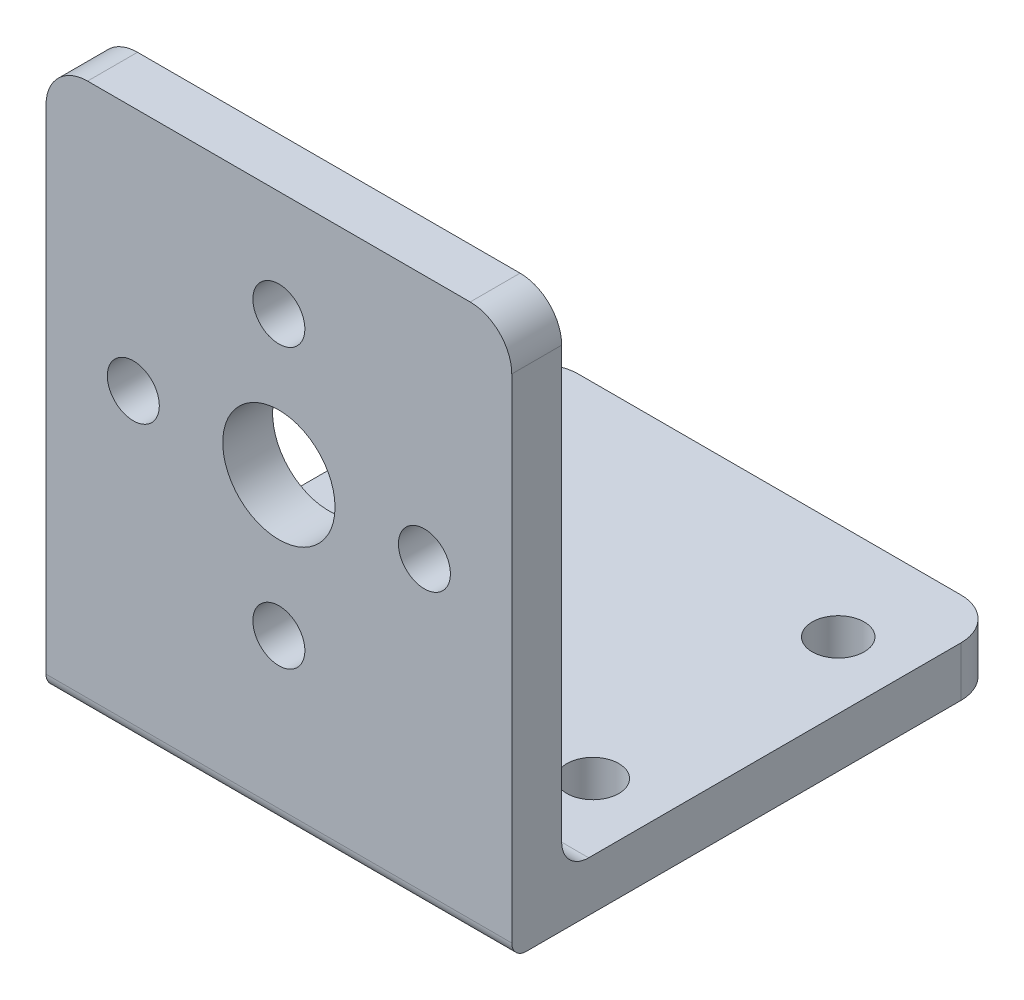
ISO-10303-21;
HEADER;
FILE_DESCRIPTION(('STEP AP214'),'2;1');
FILE_NAME('part.step','',(''),(''),'','','');
FILE_SCHEMA(('AUTOMOTIVE_DESIGN { 1 0 10303 214 1 1 1 1 }'));
ENDSEC;
DATA;
#1=APPLICATION_CONTEXT('core data for automotive mechanical design processes');
#2=APPLICATION_PROTOCOL_DEFINITION('international standard','automotive_design',2000,#1);
#3=PRODUCT_CONTEXT('',#1,'mechanical');
#4=PRODUCT('Part','Part','',(#3));
#5=PRODUCT_RELATED_PRODUCT_CATEGORY('part','',(#4));
#6=PRODUCT_DEFINITION_FORMATION('','',#4);
#7=PRODUCT_DEFINITION_CONTEXT('part definition',#1,'design');
#8=PRODUCT_DEFINITION('design','',#6,#7);
#9=PRODUCT_DEFINITION_SHAPE('','',#8);
#10=(LENGTH_UNIT() NAMED_UNIT(*) SI_UNIT(.MILLI.,.METRE.));
#11=(NAMED_UNIT(*) PLANE_ANGLE_UNIT() SI_UNIT($,.RADIAN.));
#12=(NAMED_UNIT(*) SI_UNIT($,.STERADIAN.) SOLID_ANGLE_UNIT());
#13=UNCERTAINTY_MEASURE_WITH_UNIT(LENGTH_MEASURE(1.E-05),#10,'distance_accuracy_value','');
#14=(GEOMETRIC_REPRESENTATION_CONTEXT(3) GLOBAL_UNCERTAINTY_ASSIGNED_CONTEXT((#13)) GLOBAL_UNIT_ASSIGNED_CONTEXT((#10,
#11,#12)) REPRESENTATION_CONTEXT('',''));
#15=CARTESIAN_POINT('',(0.,0.,0.));
#16=DIRECTION('',(0.,0.,1.));
#17=DIRECTION('',(1.,0.,0.));
#18=AXIS2_PLACEMENT_3D('',#15,#16,#17);
#19=CARTESIAN_POINT('',(28.448,0.,-3.048));
#20=DIRECTION('',(0.,-1.,0.));
#21=DIRECTION('',(0.,0.,1.));
#22=AXIS2_PLACEMENT_3D('',#19,#20,#21);
#23=PLANE('',#22);
#24=DIRECTION('',(-1.,0.,0.));
#25=VECTOR('',#24,1.);
#26=CARTESIAN_POINT('',(28.448,0.,0.));
#27=LINE('',#26,#25);
#28=CARTESIAN_POINT('',(25.908,0.,0.));
#29=VERTEX_POINT('',#28);
#30=CARTESIAN_POINT('',(2.54,0.,0.));
#31=VERTEX_POINT('',#30);
#32=EDGE_CURVE('E170',#29,#31,#27,.T.);
#33=ORIENTED_EDGE('',*,*,#32,.F.);
#34=DIRECTION('',(0.,0.,-1.));
#35=VECTOR('',#34,1.);
#36=CARTESIAN_POINT('',(25.908,0.,-3.048));
#37=LINE('',#36,#35);
#38=CARTESIAN_POINT('',(25.908,0.,-3.048));
#39=VERTEX_POINT('',#38);
#40=EDGE_CURVE('E214',#39,#29,#37,.F.);
#41=ORIENTED_EDGE('',*,*,#40,.F.);
#42=DIRECTION('',(-1.,0.,0.));
#43=VECTOR('',#42,1.);
#44=CARTESIAN_POINT('',(28.448,0.,-3.048));
#45=LINE('',#44,#43);
#46=CARTESIAN_POINT('',(2.54,0.,-3.048));
#47=VERTEX_POINT('',#46);
#48=EDGE_CURVE('E153',#39,#47,#45,.T.);
#49=ORIENTED_EDGE('',*,*,#48,.T.);
#50=DIRECTION('',(0.,0.,-1.));
#51=VECTOR('',#50,1.);
#52=CARTESIAN_POINT('',(2.54,0.,-3.048));
#53=LINE('',#52,#51);
#54=EDGE_CURVE('E216',#31,#47,#53,.T.);
#55=ORIENTED_EDGE('',*,*,#54,.F.);
#56=EDGE_LOOP('',(#33,#41,#49,#55));
#57=FACE_BOUND('',#56,.T.);
#58=ADVANCED_FACE('F43',(#57),#23,.F.);
#59=CARTESIAN_POINT('',(28.448,-30.48,-3.048));
#60=DIRECTION('',(0.,0.,1.));
#61=DIRECTION('',(0.,1.,0.));
#62=AXIS2_PLACEMENT_3D('',#59,#60,#61);
#63=PLANE('',#62);
#64=CARTESIAN_POINT('',(14.224,-6.477,-3.048));
#65=DIRECTION('',(0.,0.,1.));
#66=DIRECTION('',(1.,0.,0.));
#67=AXIS2_PLACEMENT_3D('',#64,#65,#66);
#68=CIRCLE('',#67,1.5875);
#69=CARTESIAN_POINT('',(15.8115,-6.477,-3.048));
#70=VERTEX_POINT('',#69);
#71=EDGE_CURVE('E242',#70,#70,#68,.T.);
#72=ORIENTED_EDGE('',*,*,#71,.T.);
#73=EDGE_LOOP('',(#72));
#74=FACE_BOUND('',#73,.T.);
#75=CARTESIAN_POINT('',(5.334,-14.986,-3.048));
#76=DIRECTION('',(0.,0.,1.));
#77=DIRECTION('',(1.,0.,0.));
#78=AXIS2_PLACEMENT_3D('',#75,#76,#77);
#79=CIRCLE('',#78,1.5875);
#80=CARTESIAN_POINT('',(6.9215,-14.986,-3.048));
#81=VERTEX_POINT('',#80);
#82=EDGE_CURVE('E248',#81,#81,#79,.T.);
#83=ORIENTED_EDGE('',*,*,#82,.T.);
#84=EDGE_LOOP('',(#83));
#85=FACE_BOUND('',#84,.T.);
#86=CARTESIAN_POINT('',(23.114,-14.986,-3.048));
#87=DIRECTION('',(0.,0.,1.));
#88=DIRECTION('',(-1.,0.,0.));
#89=AXIS2_PLACEMENT_3D('',#86,#87,#88);
#90=CIRCLE('',#89,1.5875);
#91=CARTESIAN_POINT('',(21.5265,-14.986,-3.048));
#92=VERTEX_POINT('',#91);
#93=EDGE_CURVE('E249',#92,#92,#90,.T.);
#94=ORIENTED_EDGE('',*,*,#93,.T.);
#95=EDGE_LOOP('',(#94));
#96=FACE_BOUND('',#95,.T.);
#97=CARTESIAN_POINT('',(14.224,-23.495,-3.048));
#98=DIRECTION('',(0.,0.,1.));
#99=DIRECTION('',(-1.,0.,0.));
#100=AXIS2_PLACEMENT_3D('',#97,#98,#99);
#101=CIRCLE('',#100,1.5875);
#102=CARTESIAN_POINT('',(12.6365,-23.495,-3.048));
#103=VERTEX_POINT('',#102);
#104=EDGE_CURVE('E260',#103,#103,#101,.T.);
#105=ORIENTED_EDGE('',*,*,#104,.T.);
#106=EDGE_LOOP('',(#105));
#107=FACE_BOUND('',#106,.T.);
#108=CARTESIAN_POINT('',(14.224,-14.986,-3.048));
#109=DIRECTION('',(0.,0.,1.));
#110=DIRECTION('',(1.,0.,0.));
#111=AXIS2_PLACEMENT_3D('',#108,#109,#110);
#112=CIRCLE('',#111,3.42900000000001);
#113=CARTESIAN_POINT('',(17.653,-14.986,-3.048));
#114=VERTEX_POINT('',#113);
#115=EDGE_CURVE('E239',#114,#114,#112,.T.);
#116=ORIENTED_EDGE('',*,*,#115,.T.);
#117=EDGE_LOOP('',(#116));
#118=FACE_BOUND('',#117,.T.);
#119=ORIENTED_EDGE('',*,*,#48,.F.);
#120=CARTESIAN_POINT('',(25.908,-2.54,-3.048));
#121=DIRECTION('',(0.,0.,-1.));
#122=DIRECTION('',(0.,1.,0.));
#123=AXIS2_PLACEMENT_3D('',#120,#121,#122);
#124=CIRCLE('',#123,2.54);
#125=CARTESIAN_POINT('',(28.448,-2.54000000000001,-3.048));
#126=VERTEX_POINT('',#125);
#127=EDGE_CURVE('E218',#126,#39,#124,.F.);
#128=ORIENTED_EDGE('',*,*,#127,.F.);
#129=DIRECTION('',(0.,-1.,0.));
#130=VECTOR('',#129,1.);
#131=CARTESIAN_POINT('',(28.448,-30.48,-3.048));
#132=LINE('',#131,#130);
#133=CARTESIAN_POINT('',(28.448,-28.829,-3.048));
#134=VERTEX_POINT('',#133);
#135=EDGE_CURVE('E169',#126,#134,#132,.T.);
#136=ORIENTED_EDGE('',*,*,#135,.T.);
#137=DIRECTION('',(-1.,0.,0.));
#138=VECTOR('',#137,1.);
#139=CARTESIAN_POINT('',(28.448,-28.829,-3.048));
#140=LINE('',#139,#138);
#141=CARTESIAN_POINT('',(0.,-28.829,-3.048));
#142=VERTEX_POINT('',#141);
#143=EDGE_CURVE('E145',#142,#134,#140,.F.);
#144=ORIENTED_EDGE('',*,*,#143,.F.);
#145=DIRECTION('',(0.,-1.,0.));
#146=VECTOR('',#145,1.);
#147=CARTESIAN_POINT('',(0.,-30.48,-3.048));
#148=LINE('',#147,#146);
#149=CARTESIAN_POINT('',(0.,-2.54000000000001,-3.048));
#150=VERTEX_POINT('',#149);
#151=EDGE_CURVE('E140',#150,#142,#148,.T.);
#152=ORIENTED_EDGE('',*,*,#151,.F.);
#153=CARTESIAN_POINT('',(2.54,-2.54,-3.048));
#154=DIRECTION('',(0.,0.,-1.));
#155=DIRECTION('',(0.,1.,0.));
#156=AXIS2_PLACEMENT_3D('',#153,#154,#155);
#157=CIRCLE('',#156,2.54);
#158=EDGE_CURVE('E220',#47,#150,#157,.F.);
#159=ORIENTED_EDGE('',*,*,#158,.F.);
#160=EDGE_LOOP('',(#119,#128,#136,#144,#152,#159));
#161=FACE_BOUND('',#160,.T.);
#162=ADVANCED_FACE('F312',(#74,#85,#96,#107,#118,#161),#63,.F.);
#163=CARTESIAN_POINT('',(28.448,-30.48,-29.972));
#164=DIRECTION('',(0.,-1.,0.));
#165=DIRECTION('',(0.,0.,1.));
#166=AXIS2_PLACEMENT_3D('',#163,#164,#165);
#167=PLANE('',#166);
#168=CARTESIAN_POINT('',(24.384,-30.48,-24.003));
#169=DIRECTION('',(0.,-1.,0.));
#170=DIRECTION('',(0.,0.,1.));
#171=AXIS2_PLACEMENT_3D('',#168,#169,#170);
#172=CIRCLE('',#171,1.5875);
#173=CARTESIAN_POINT('',(24.384,-30.48,-22.4155));
#174=VERTEX_POINT('',#173);
#175=EDGE_CURVE('E278',#174,#174,#172,.T.);
#176=ORIENTED_EDGE('',*,*,#175,.T.);
#177=EDGE_LOOP('',(#176));
#178=FACE_BOUND('',#177,.T.);
#179=CARTESIAN_POINT('',(4.064,-30.48,-24.003));
#180=DIRECTION('',(0.,-1.,0.));
#181=DIRECTION('',(0.,0.,-1.));
#182=AXIS2_PLACEMENT_3D('',#179,#180,#181);
#183=CIRCLE('',#182,1.5875);
#184=CARTESIAN_POINT('',(4.064,-30.48,-25.5905));
#185=VERTEX_POINT('',#184);
#186=EDGE_CURVE('E284',#185,#185,#183,.T.);
#187=ORIENTED_EDGE('',*,*,#186,.T.);
#188=EDGE_LOOP('',(#187));
#189=FACE_BOUND('',#188,.T.);
#190=CARTESIAN_POINT('',(4.064,-30.48,-9.017));
#191=DIRECTION('',(0.,-1.,0.));
#192=DIRECTION('',(0.,0.,1.));
#193=AXIS2_PLACEMENT_3D('',#190,#191,#192);
#194=CIRCLE('',#193,1.5875);
#195=CARTESIAN_POINT('',(4.064,-30.48,-7.4295));
#196=VERTEX_POINT('',#195);
#197=EDGE_CURVE('E272',#196,#196,#194,.T.);
#198=ORIENTED_EDGE('',*,*,#197,.T.);
#199=EDGE_LOOP('',(#198));
#200=FACE_BOUND('',#199,.T.);
#201=CARTESIAN_POINT('',(24.384,-30.48,-9.01699999999999));
#202=DIRECTION('',(0.,-1.,0.));
#203=DIRECTION('',(0.,0.,-1.));
#204=AXIS2_PLACEMENT_3D('',#201,#202,#203);
#205=CIRCLE('',#204,1.5875);
#206=CARTESIAN_POINT('',(24.384,-30.48,-10.6045));
#207=VERTEX_POINT('',#206);
#208=EDGE_CURVE('E269',#207,#207,#205,.T.);
#209=ORIENTED_EDGE('',*,*,#208,.T.);
#210=EDGE_LOOP('',(#209));
#211=FACE_BOUND('',#210,.T.);
#212=DIRECTION('',(-1.,0.,0.));
#213=VECTOR('',#212,1.);
#214=CARTESIAN_POINT('',(28.448,-30.48,-29.972));
#215=LINE('',#214,#213);
#216=CARTESIAN_POINT('',(25.908,-30.48,-29.972));
#217=VERTEX_POINT('',#216);
#218=CARTESIAN_POINT('',(2.54,-30.48,-29.972));
#219=VERTEX_POINT('',#218);
#220=EDGE_CURVE('E176',#217,#219,#215,.T.);
#221=ORIENTED_EDGE('',*,*,#220,.T.);
#222=CARTESIAN_POINT('',(2.54,-30.48,-27.432));
#223=DIRECTION('',(0.,1.,0.));
#224=DIRECTION('',(0.,0.,1.));
#225=AXIS2_PLACEMENT_3D('',#222,#223,#224);
#226=CIRCLE('',#225,2.54);
#227=CARTESIAN_POINT('',(0.,-30.48,-27.432));
#228=VERTEX_POINT('',#227);
#229=EDGE_CURVE('E158',#228,#219,#226,.F.);
#230=ORIENTED_EDGE('',*,*,#229,.F.);
#231=DIRECTION('',(0.,0.,-1.));
#232=VECTOR('',#231,1.);
#233=CARTESIAN_POINT('',(0.,-30.48,-29.972));
#234=LINE('',#233,#232);
#235=CARTESIAN_POINT('',(0.,-30.48,-4.699));
#236=VERTEX_POINT('',#235);
#237=EDGE_CURVE('E137',#236,#228,#234,.T.);
#238=ORIENTED_EDGE('',*,*,#237,.F.);
#239=DIRECTION('',(-1.,0.,0.));
#240=VECTOR('',#239,1.);
#241=CARTESIAN_POINT('',(0.,-30.48,-4.69899999999999));
#242=LINE('',#241,#240);
#243=CARTESIAN_POINT('',(28.448,-30.48,-4.699));
#244=VERTEX_POINT('',#243);
#245=EDGE_CURVE('E148',#244,#236,#242,.T.);
#246=ORIENTED_EDGE('',*,*,#245,.F.);
#247=DIRECTION('',(0.,0.,-1.));
#248=VECTOR('',#247,1.);
#249=CARTESIAN_POINT('',(28.448,-30.48,-29.972));
#250=LINE('',#249,#248);
#251=CARTESIAN_POINT('',(28.448,-30.48,-27.432));
#252=VERTEX_POINT('',#251);
#253=EDGE_CURVE('E233',#244,#252,#250,.T.);
#254=ORIENTED_EDGE('',*,*,#253,.T.);
#255=CARTESIAN_POINT('',(25.908,-30.48,-27.432));
#256=DIRECTION('',(0.,1.,0.));
#257=DIRECTION('',(0.,0.,1.));
#258=AXIS2_PLACEMENT_3D('',#255,#256,#257);
#259=CIRCLE('',#258,2.54);
#260=EDGE_CURVE('E207',#217,#252,#259,.F.);
#261=ORIENTED_EDGE('',*,*,#260,.F.);
#262=EDGE_LOOP('',(#221,#230,#238,#246,#254,#261));
#263=FACE_BOUND('',#262,.T.);
#264=ADVANCED_FACE('F156',(#178,#189,#200,#211,#263),#167,.F.);
#265=CARTESIAN_POINT('',(28.448,-33.528,-29.972));
#266=DIRECTION('',(0.,0.,1.));
#267=DIRECTION('',(-1.,0.,0.));
#268=AXIS2_PLACEMENT_3D('',#265,#266,#267);
#269=PLANE('',#268);
#270=DIRECTION('',(-1.,0.,0.));
#271=VECTOR('',#270,1.);
#272=CARTESIAN_POINT('',(28.448,-33.528,-29.972));
#273=LINE('',#272,#271);
#274=CARTESIAN_POINT('',(25.908,-33.528,-29.972));
#275=VERTEX_POINT('',#274);
#276=CARTESIAN_POINT('',(2.54,-33.528,-29.972));
#277=VERTEX_POINT('',#276);
#278=EDGE_CURVE('E172',#275,#277,#273,.T.);
#279=ORIENTED_EDGE('',*,*,#278,.T.);
#280=DIRECTION('',(0.,-1.,0.));
#281=VECTOR('',#280,1.);
#282=CARTESIAN_POINT('',(2.54,-33.528,-29.972));
#283=LINE('',#282,#281);
#284=EDGE_CURVE('E201',#219,#277,#283,.T.);
#285=ORIENTED_EDGE('',*,*,#284,.F.);
#286=ORIENTED_EDGE('',*,*,#220,.F.);
#287=DIRECTION('',(0.,-1.,0.));
#288=VECTOR('',#287,1.);
#289=CARTESIAN_POINT('',(25.908,-33.528,-29.972));
#290=LINE('',#289,#288);
#291=EDGE_CURVE('E204',#275,#217,#290,.F.);
#292=ORIENTED_EDGE('',*,*,#291,.F.);
#293=EDGE_LOOP('',(#279,#285,#286,#292));
#294=FACE_BOUND('',#293,.T.);
#295=ADVANCED_FACE('F484',(#294),#269,.F.);
#296=CARTESIAN_POINT('',(28.448,-33.528,0.));
#297=DIRECTION('',(0.,1.,0.));
#298=DIRECTION('',(0.,0.,-1.));
#299=AXIS2_PLACEMENT_3D('',#296,#297,#298);
#300=PLANE('',#299);
#301=CARTESIAN_POINT('',(24.384,-33.528,-24.003));
#302=DIRECTION('',(0.,-1.,0.));
#303=DIRECTION('',(0.,0.,1.));
#304=AXIS2_PLACEMENT_3D('',#301,#302,#303);
#305=CIRCLE('',#304,1.5875);
#306=CARTESIAN_POINT('',(24.384,-33.528,-22.4155));
#307=VERTEX_POINT('',#306);
#308=EDGE_CURVE('E275',#307,#307,#305,.T.);
#309=ORIENTED_EDGE('',*,*,#308,.F.);
#310=EDGE_LOOP('',(#309));
#311=FACE_BOUND('',#310,.T.);
#312=CARTESIAN_POINT('',(4.064,-33.528,-24.003));
#313=DIRECTION('',(0.,-1.,0.));
#314=DIRECTION('',(0.,0.,-1.));
#315=AXIS2_PLACEMENT_3D('',#312,#313,#314);
#316=CIRCLE('',#315,1.5875);
#317=CARTESIAN_POINT('',(4.064,-33.528,-25.5905));
#318=VERTEX_POINT('',#317);
#319=EDGE_CURVE('E281',#318,#318,#316,.T.);
#320=ORIENTED_EDGE('',*,*,#319,.F.);
#321=EDGE_LOOP('',(#320));
#322=FACE_BOUND('',#321,.T.);
#323=CARTESIAN_POINT('',(4.064,-33.528,-9.017));
#324=DIRECTION('',(0.,-1.,0.));
#325=DIRECTION('',(0.,0.,1.));
#326=AXIS2_PLACEMENT_3D('',#323,#324,#325);
#327=CIRCLE('',#326,1.5875);
#328=CARTESIAN_POINT('',(4.064,-33.528,-7.4295));
#329=VERTEX_POINT('',#328);
#330=EDGE_CURVE('E287',#329,#329,#327,.T.);
#331=ORIENTED_EDGE('',*,*,#330,.F.);
#332=EDGE_LOOP('',(#331));
#333=FACE_BOUND('',#332,.T.);
#334=CARTESIAN_POINT('',(24.384,-33.528,-9.01699999999999));
#335=DIRECTION('',(0.,-1.,0.));
#336=DIRECTION('',(0.,0.,-1.));
#337=AXIS2_PLACEMENT_3D('',#334,#335,#336);
#338=CIRCLE('',#337,1.5875);
#339=CARTESIAN_POINT('',(24.384,-33.528,-10.6045));
#340=VERTEX_POINT('',#339);
#341=EDGE_CURVE('E261',#340,#340,#338,.T.);
#342=ORIENTED_EDGE('',*,*,#341,.F.);
#343=EDGE_LOOP('',(#342));
#344=FACE_BOUND('',#343,.T.);
#345=DIRECTION('',(0.,0.,1.));
#346=VECTOR('',#345,1.);
#347=CARTESIAN_POINT('',(28.448,-33.528,0.));
#348=LINE('',#347,#346);
#349=CARTESIAN_POINT('',(28.448,-33.528,-27.432));
#350=VERTEX_POINT('',#349);
#351=CARTESIAN_POINT('',(28.448,-33.528,-0.888999999999995));
#352=VERTEX_POINT('',#351);
#353=EDGE_CURVE('E231',#350,#352,#348,.T.);
#354=ORIENTED_EDGE('',*,*,#353,.T.);
#355=DIRECTION('',(-1.,0.,0.));
#356=VECTOR('',#355,1.);
#357=CARTESIAN_POINT('',(28.448,-33.528,-0.888999999999996));
#358=LINE('',#357,#356);
#359=CARTESIAN_POINT('',(0.,-33.528,-0.888999999999995));
#360=VERTEX_POINT('',#359);
#361=EDGE_CURVE('E187',#360,#352,#358,.F.);
#362=ORIENTED_EDGE('',*,*,#361,.F.);
#363=DIRECTION('',(0.,0.,1.));
#364=VECTOR('',#363,1.);
#365=CARTESIAN_POINT('',(0.,-33.528,0.));
#366=LINE('',#365,#364);
#367=CARTESIAN_POINT('',(0.,-33.528,-27.432));
#368=VERTEX_POINT('',#367);
#369=EDGE_CURVE('E159',#368,#360,#366,.T.);
#370=ORIENTED_EDGE('',*,*,#369,.F.);
#371=CARTESIAN_POINT('',(2.54,-33.528,-27.432));
#372=DIRECTION('',(0.,-1.,0.));
#373=DIRECTION('',(0.,0.,-1.));
#374=AXIS2_PLACEMENT_3D('',#371,#372,#373);
#375=CIRCLE('',#374,2.54);
#376=EDGE_CURVE('E196',#277,#368,#375,.F.);
#377=ORIENTED_EDGE('',*,*,#376,.F.);
#378=ORIENTED_EDGE('',*,*,#278,.F.);
#379=CARTESIAN_POINT('',(25.908,-33.528,-27.432));
#380=DIRECTION('',(0.,-1.,0.));
#381=DIRECTION('',(0.,0.,-1.));
#382=AXIS2_PLACEMENT_3D('',#379,#380,#381);
#383=CIRCLE('',#382,2.54);
#384=EDGE_CURVE('E199',#350,#275,#383,.F.);
#385=ORIENTED_EDGE('',*,*,#384,.F.);
#386=EDGE_LOOP('',(#354,#362,#370,#377,#378,#385));
#387=FACE_BOUND('',#386,.T.);
#388=ADVANCED_FACE('F474',(#311,#322,#333,#344,#387),#300,.F.);
#389=CARTESIAN_POINT('',(28.448,0.,0.));
#390=DIRECTION('',(0.,0.,-1.));
#391=DIRECTION('',(0.,-1.,0.));
#392=AXIS2_PLACEMENT_3D('',#389,#390,#391);
#393=PLANE('',#392);
#394=CARTESIAN_POINT('',(14.224,-6.477,0.));
#395=DIRECTION('',(0.,0.,1.));
#396=DIRECTION('',(1.,0.,0.));
#397=AXIS2_PLACEMENT_3D('',#394,#395,#396);
#398=CIRCLE('',#397,1.5875);
#399=CARTESIAN_POINT('',(15.8115,-6.477,0.));
#400=VERTEX_POINT('',#399);
#401=EDGE_CURVE('E252',#400,#400,#398,.T.);
#402=ORIENTED_EDGE('',*,*,#401,.F.);
#403=EDGE_LOOP('',(#402));
#404=FACE_BOUND('',#403,.T.);
#405=CARTESIAN_POINT('',(5.334,-14.986,0.));
#406=DIRECTION('',(0.,0.,1.));
#407=DIRECTION('',(1.,0.,0.));
#408=AXIS2_PLACEMENT_3D('',#405,#406,#407);
#409=CIRCLE('',#408,1.5875);
#410=CARTESIAN_POINT('',(6.9215,-14.986,0.));
#411=VERTEX_POINT('',#410);
#412=EDGE_CURVE('E245',#411,#411,#409,.T.);
#413=ORIENTED_EDGE('',*,*,#412,.F.);
#414=EDGE_LOOP('',(#413));
#415=FACE_BOUND('',#414,.T.);
#416=CARTESIAN_POINT('',(23.114,-14.986,0.));
#417=DIRECTION('',(0.,0.,1.));
#418=DIRECTION('',(-1.,0.,0.));
#419=AXIS2_PLACEMENT_3D('',#416,#417,#418);
#420=CIRCLE('',#419,1.5875);
#421=CARTESIAN_POINT('',(21.5265,-14.986,0.));
#422=VERTEX_POINT('',#421);
#423=EDGE_CURVE('E264',#422,#422,#420,.T.);
#424=ORIENTED_EDGE('',*,*,#423,.F.);
#425=EDGE_LOOP('',(#424));
#426=FACE_BOUND('',#425,.T.);
#427=CARTESIAN_POINT('',(14.224,-23.495,0.));
#428=DIRECTION('',(0.,0.,1.));
#429=DIRECTION('',(-1.,0.,0.));
#430=AXIS2_PLACEMENT_3D('',#427,#428,#429);
#431=CIRCLE('',#430,1.5875);
#432=CARTESIAN_POINT('',(12.6365,-23.495,0.));
#433=VERTEX_POINT('',#432);
#434=EDGE_CURVE('E257',#433,#433,#431,.T.);
#435=ORIENTED_EDGE('',*,*,#434,.F.);
#436=EDGE_LOOP('',(#435));
#437=FACE_BOUND('',#436,.T.);
#438=CARTESIAN_POINT('',(14.224,-14.986,0.));
#439=DIRECTION('',(0.,0.,1.));
#440=DIRECTION('',(1.,0.,0.));
#441=AXIS2_PLACEMENT_3D('',#438,#439,#440);
#442=CIRCLE('',#441,3.42900000000001);
#443=CARTESIAN_POINT('',(17.653,-14.986,0.));
#444=VERTEX_POINT('',#443);
#445=EDGE_CURVE('E163',#444,#444,#442,.T.);
#446=ORIENTED_EDGE('',*,*,#445,.F.);
#447=EDGE_LOOP('',(#446));
#448=FACE_BOUND('',#447,.T.);
#449=DIRECTION('',(0.,1.,0.));
#450=VECTOR('',#449,1.);
#451=CARTESIAN_POINT('',(0.,0.,0.));
#452=LINE('',#451,#450);
#453=CARTESIAN_POINT('',(0.,-32.639,0.));
#454=VERTEX_POINT('',#453);
#455=CARTESIAN_POINT('',(0.,-2.54,0.));
#456=VERTEX_POINT('',#455);
#457=EDGE_CURVE('E161',#454,#456,#452,.T.);
#458=ORIENTED_EDGE('',*,*,#457,.F.);
#459=DIRECTION('',(-1.,0.,0.));
#460=VECTOR('',#459,1.);
#461=CARTESIAN_POINT('',(28.448,-32.639,0.));
#462=LINE('',#461,#460);
#463=CARTESIAN_POINT('',(28.448,-32.639,0.));
#464=VERTEX_POINT('',#463);
#465=EDGE_CURVE('E182',#464,#454,#462,.T.);
#466=ORIENTED_EDGE('',*,*,#465,.F.);
#467=DIRECTION('',(0.,1.,0.));
#468=VECTOR('',#467,1.);
#469=CARTESIAN_POINT('',(28.448,0.,0.));
#470=LINE('',#469,#468);
#471=CARTESIAN_POINT('',(28.448,-2.54,0.));
#472=VERTEX_POINT('',#471);
#473=EDGE_CURVE('E173',#464,#472,#470,.T.);
#474=ORIENTED_EDGE('',*,*,#473,.T.);
#475=CARTESIAN_POINT('',(25.908,-2.54,0.));
#476=DIRECTION('',(0.,0.,1.));
#477=DIRECTION('',(0.,-1.,0.));
#478=AXIS2_PLACEMENT_3D('',#475,#476,#477);
#479=CIRCLE('',#478,2.54);
#480=EDGE_CURVE('E51',#29,#472,#479,.F.);
#481=ORIENTED_EDGE('',*,*,#480,.F.);
#482=ORIENTED_EDGE('',*,*,#32,.T.);
#483=CARTESIAN_POINT('',(2.54,-2.54,0.));
#484=DIRECTION('',(0.,0.,1.));
#485=DIRECTION('',(0.,-1.,0.));
#486=AXIS2_PLACEMENT_3D('',#483,#484,#485);
#487=CIRCLE('',#486,2.54);
#488=EDGE_CURVE('E11',#456,#31,#487,.F.);
#489=ORIENTED_EDGE('',*,*,#488,.F.);
#490=EDGE_LOOP('',(#458,#466,#474,#481,#482,#489));
#491=FACE_BOUND('',#490,.T.);
#492=ADVANCED_FACE('F229',(#404,#415,#426,#437,#448,#491),#393,.F.);
#493=CARTESIAN_POINT('',(28.448,0.,0.));
#494=DIRECTION('',(-1.,0.,0.));
#495=DIRECTION('',(0.,0.,-1.));
#496=AXIS2_PLACEMENT_3D('',#493,#494,#495);
#497=PLANE('',#496);
#498=ORIENTED_EDGE('',*,*,#253,.F.);
#499=CARTESIAN_POINT('',(28.448,-28.829,-4.69899999999999));
#500=DIRECTION('',(1.,0.,0.));
#501=DIRECTION('',(0.,0.,-1.));
#502=AXIS2_PLACEMENT_3D('',#499,#500,#501);
#503=CIRCLE('',#502,1.651);
#504=EDGE_CURVE('E144',#134,#244,#503,.T.);
#505=ORIENTED_EDGE('',*,*,#504,.F.);
#506=ORIENTED_EDGE('',*,*,#135,.F.);
#507=DIRECTION('',(0.,0.,-1.));
#508=VECTOR('',#507,1.);
#509=CARTESIAN_POINT('',(28.448,-2.54,0.));
#510=LINE('',#509,#508);
#511=EDGE_CURVE('E192',#472,#126,#510,.T.);
#512=ORIENTED_EDGE('',*,*,#511,.F.);
#513=ORIENTED_EDGE('',*,*,#473,.F.);
#514=CARTESIAN_POINT('',(28.448,-32.639,-0.888999999999996));
#515=DIRECTION('',(1.,0.,0.));
#516=DIRECTION('',(0.,0.,-1.));
#517=AXIS2_PLACEMENT_3D('',#514,#515,#516);
#518=CIRCLE('',#517,0.889);
#519=EDGE_CURVE('E190',#352,#464,#518,.F.);
#520=ORIENTED_EDGE('',*,*,#519,.F.);
#521=ORIENTED_EDGE('',*,*,#353,.F.);
#522=DIRECTION('',(0.,-1.,0.));
#523=VECTOR('',#522,1.);
#524=CARTESIAN_POINT('',(28.448,0.,-27.432));
#525=LINE('',#524,#523);
#526=EDGE_CURVE('E194',#252,#350,#525,.T.);
#527=ORIENTED_EDGE('',*,*,#526,.F.);
#528=EDGE_LOOP('',(#498,#505,#506,#512,#513,#520,#521,#527));
#529=FACE_BOUND('',#528,.T.);
#530=ADVANCED_FACE('F457',(#529),#497,.F.);
#531=CARTESIAN_POINT('',(0.,0.,0.));
#532=DIRECTION('',(-1.,0.,0.));
#533=DIRECTION('',(0.,0.,-1.));
#534=AXIS2_PLACEMENT_3D('',#531,#532,#533);
#535=PLANE('',#534);
#536=ORIENTED_EDGE('',*,*,#369,.T.);
#537=CARTESIAN_POINT('',(0.,-32.639,-0.888999999999996));
#538=DIRECTION('',(1.,0.,0.));
#539=DIRECTION('',(0.,0.,-1.));
#540=AXIS2_PLACEMENT_3D('',#537,#538,#539);
#541=CIRCLE('',#540,0.889);
#542=EDGE_CURVE('E185',#454,#360,#541,.T.);
#543=ORIENTED_EDGE('',*,*,#542,.F.);
#544=ORIENTED_EDGE('',*,*,#457,.T.);
#545=DIRECTION('',(0.,0.,-1.));
#546=VECTOR('',#545,1.);
#547=CARTESIAN_POINT('',(0.,-2.54,0.));
#548=LINE('',#547,#546);
#549=EDGE_CURVE('E210',#150,#456,#548,.F.);
#550=ORIENTED_EDGE('',*,*,#549,.F.);
#551=ORIENTED_EDGE('',*,*,#151,.T.);
#552=CARTESIAN_POINT('',(0.,-28.829,-4.69899999999999));
#553=DIRECTION('',(1.,0.,0.));
#554=DIRECTION('',(0.,0.,-1.));
#555=AXIS2_PLACEMENT_3D('',#552,#553,#554);
#556=CIRCLE('',#555,1.651);
#557=EDGE_CURVE('E132',#236,#142,#556,.F.);
#558=ORIENTED_EDGE('',*,*,#557,.F.);
#559=ORIENTED_EDGE('',*,*,#237,.T.);
#560=DIRECTION('',(0.,-1.,0.));
#561=VECTOR('',#560,1.);
#562=CARTESIAN_POINT('',(0.,-30.48,-27.432));
#563=LINE('',#562,#561);
#564=EDGE_CURVE('E212',#368,#228,#563,.F.);
#565=ORIENTED_EDGE('',*,*,#564,.F.);
#566=EDGE_LOOP('',(#536,#543,#544,#550,#551,#558,#559,#565));
#567=FACE_BOUND('',#566,.T.);
#568=ADVANCED_FACE('F135',(#567),#535,.T.);
#569=CARTESIAN_POINT('',(14.224,-14.986,0.));
#570=DIRECTION('',(0.,0.,-1.));
#571=DIRECTION('',(1.,0.,0.));
#572=AXIS2_PLACEMENT_3D('',#569,#570,#571);
#573=CYLINDRICAL_SURFACE('',#572,3.42900000000001);
#574=ORIENTED_EDGE('',*,*,#445,.T.);
#575=EDGE_LOOP('',(#574));
#576=FACE_BOUND('',#575,.T.);
#577=ORIENTED_EDGE('',*,*,#115,.F.);
#578=EDGE_LOOP('',(#577));
#579=FACE_BOUND('',#578,.T.);
#580=ADVANCED_FACE('F438',(#576,#579),#573,.F.);
#581=CARTESIAN_POINT('',(14.224,-23.495,0.));
#582=DIRECTION('',(0.,0.,-1.));
#583=DIRECTION('',(1.,0.,0.));
#584=AXIS2_PLACEMENT_3D('',#581,#582,#583);
#585=CYLINDRICAL_SURFACE('',#584,1.5875);
#586=ORIENTED_EDGE('',*,*,#434,.T.);
#587=EDGE_LOOP('',(#586));
#588=FACE_BOUND('',#587,.T.);
#589=ORIENTED_EDGE('',*,*,#104,.F.);
#590=EDGE_LOOP('',(#589));
#591=FACE_BOUND('',#590,.T.);
#592=ADVANCED_FACE('F428',(#588,#591),#585,.F.);
#593=CARTESIAN_POINT('',(23.114,-14.986,0.));
#594=DIRECTION('',(0.,0.,-1.));
#595=DIRECTION('',(1.,0.,0.));
#596=AXIS2_PLACEMENT_3D('',#593,#594,#595);
#597=CYLINDRICAL_SURFACE('',#596,1.5875);
#598=ORIENTED_EDGE('',*,*,#423,.T.);
#599=EDGE_LOOP('',(#598));
#600=FACE_BOUND('',#599,.T.);
#601=ORIENTED_EDGE('',*,*,#93,.F.);
#602=EDGE_LOOP('',(#601));
#603=FACE_BOUND('',#602,.T.);
#604=ADVANCED_FACE('F418',(#600,#603),#597,.F.);
#605=CARTESIAN_POINT('',(5.334,-14.986,0.));
#606=DIRECTION('',(0.,0.,-1.));
#607=DIRECTION('',(1.,0.,0.));
#608=AXIS2_PLACEMENT_3D('',#605,#606,#607);
#609=CYLINDRICAL_SURFACE('',#608,1.5875);
#610=ORIENTED_EDGE('',*,*,#412,.T.);
#611=EDGE_LOOP('',(#610));
#612=FACE_BOUND('',#611,.T.);
#613=ORIENTED_EDGE('',*,*,#82,.F.);
#614=EDGE_LOOP('',(#613));
#615=FACE_BOUND('',#614,.T.);
#616=ADVANCED_FACE('F408',(#612,#615),#609,.F.);
#617=CARTESIAN_POINT('',(14.224,-6.477,0.));
#618=DIRECTION('',(0.,0.,-1.));
#619=DIRECTION('',(1.,0.,0.));
#620=AXIS2_PLACEMENT_3D('',#617,#618,#619);
#621=CYLINDRICAL_SURFACE('',#620,1.5875);
#622=ORIENTED_EDGE('',*,*,#401,.T.);
#623=EDGE_LOOP('',(#622));
#624=FACE_BOUND('',#623,.T.);
#625=ORIENTED_EDGE('',*,*,#71,.F.);
#626=EDGE_LOOP('',(#625));
#627=FACE_BOUND('',#626,.T.);
#628=ADVANCED_FACE('F308',(#624,#627),#621,.F.);
#629=CARTESIAN_POINT('',(24.384,-33.528,-9.01699999999999));
#630=DIRECTION('',(0.,1.,0.));
#631=DIRECTION('',(0.,0.,-1.));
#632=AXIS2_PLACEMENT_3D('',#629,#630,#631);
#633=CYLINDRICAL_SURFACE('',#632,1.5875);
#634=ORIENTED_EDGE('',*,*,#341,.T.);
#635=EDGE_LOOP('',(#634));
#636=FACE_BOUND('',#635,.T.);
#637=ORIENTED_EDGE('',*,*,#208,.F.);
#638=EDGE_LOOP('',(#637));
#639=FACE_BOUND('',#638,.T.);
#640=ADVANCED_FACE('F298',(#636,#639),#633,.F.);
#641=CARTESIAN_POINT('',(4.064,-33.528,-9.017));
#642=DIRECTION('',(0.,1.,0.));
#643=DIRECTION('',(0.,0.,-1.));
#644=AXIS2_PLACEMENT_3D('',#641,#642,#643);
#645=CYLINDRICAL_SURFACE('',#644,1.5875);
#646=ORIENTED_EDGE('',*,*,#330,.T.);
#647=EDGE_LOOP('',(#646));
#648=FACE_BOUND('',#647,.T.);
#649=ORIENTED_EDGE('',*,*,#197,.F.);
#650=EDGE_LOOP('',(#649));
#651=FACE_BOUND('',#650,.T.);
#652=ADVANCED_FACE('F295',(#648,#651),#645,.F.);
#653=CARTESIAN_POINT('',(4.064,-33.528,-24.003));
#654=DIRECTION('',(0.,1.,0.));
#655=DIRECTION('',(0.,0.,-1.));
#656=AXIS2_PLACEMENT_3D('',#653,#654,#655);
#657=CYLINDRICAL_SURFACE('',#656,1.5875);
#658=ORIENTED_EDGE('',*,*,#319,.T.);
#659=EDGE_LOOP('',(#658));
#660=FACE_BOUND('',#659,.T.);
#661=ORIENTED_EDGE('',*,*,#186,.F.);
#662=EDGE_LOOP('',(#661));
#663=FACE_BOUND('',#662,.T.);
#664=ADVANCED_FACE('F297',(#660,#663),#657,.F.);
#665=CARTESIAN_POINT('',(24.384,-33.528,-24.003));
#666=DIRECTION('',(0.,1.,0.));
#667=DIRECTION('',(0.,0.,-1.));
#668=AXIS2_PLACEMENT_3D('',#665,#666,#667);
#669=CYLINDRICAL_SURFACE('',#668,1.5875);
#670=ORIENTED_EDGE('',*,*,#308,.T.);
#671=EDGE_LOOP('',(#670));
#672=FACE_BOUND('',#671,.T.);
#673=ORIENTED_EDGE('',*,*,#175,.F.);
#674=EDGE_LOOP('',(#673));
#675=FACE_BOUND('',#674,.T.);
#676=ADVANCED_FACE('F305',(#672,#675),#669,.F.);
#677=CARTESIAN_POINT('',(28.448,-28.829,-4.69899999999999));
#678=DIRECTION('',(1.,0.,0.));
#679=DIRECTION('',(0.,0.,1.));
#680=AXIS2_PLACEMENT_3D('',#677,#678,#679);
#681=CYLINDRICAL_SURFACE('',#680,1.651);
#682=ORIENTED_EDGE('',*,*,#504,.T.);
#683=ORIENTED_EDGE('',*,*,#245,.T.);
#684=ORIENTED_EDGE('',*,*,#557,.T.);
#685=ORIENTED_EDGE('',*,*,#143,.T.);
#686=EDGE_LOOP('',(#682,#683,#684,#685));
#687=FACE_BOUND('',#686,.T.);
#688=ADVANCED_FACE('F149',(#687),#681,.F.);
#689=CARTESIAN_POINT('',(28.448,-32.639,-0.888999999999996));
#690=DIRECTION('',(-1.,0.,0.));
#691=DIRECTION('',(0.,0.,-1.));
#692=AXIS2_PLACEMENT_3D('',#689,#690,#691);
#693=CYLINDRICAL_SURFACE('',#692,0.889);
#694=ORIENTED_EDGE('',*,*,#519,.T.);
#695=ORIENTED_EDGE('',*,*,#465,.T.);
#696=ORIENTED_EDGE('',*,*,#542,.T.);
#697=ORIENTED_EDGE('',*,*,#361,.T.);
#698=EDGE_LOOP('',(#694,#695,#696,#697));
#699=FACE_BOUND('',#698,.T.);
#700=ADVANCED_FACE('F324',(#699),#693,.T.);
#701=CARTESIAN_POINT('',(25.908,0.,-27.432));
#702=DIRECTION('',(0.,-1.,0.));
#703=DIRECTION('',(0.,0.,1.));
#704=AXIS2_PLACEMENT_3D('',#701,#702,#703);
#705=CYLINDRICAL_SURFACE('',#704,2.54);
#706=ORIENTED_EDGE('',*,*,#260,.T.);
#707=ORIENTED_EDGE('',*,*,#526,.T.);
#708=ORIENTED_EDGE('',*,*,#384,.T.);
#709=ORIENTED_EDGE('',*,*,#291,.T.);
#710=EDGE_LOOP('',(#706,#707,#708,#709));
#711=FACE_BOUND('',#710,.T.);
#712=ADVANCED_FACE('F327',(#711),#705,.T.);
#713=CARTESIAN_POINT('',(2.54,-33.528,-27.432));
#714=DIRECTION('',(0.,1.,0.));
#715=DIRECTION('',(0.,0.,-1.));
#716=AXIS2_PLACEMENT_3D('',#713,#714,#715);
#717=CYLINDRICAL_SURFACE('',#716,2.54);
#718=ORIENTED_EDGE('',*,*,#229,.T.);
#719=ORIENTED_EDGE('',*,*,#284,.T.);
#720=ORIENTED_EDGE('',*,*,#376,.T.);
#721=ORIENTED_EDGE('',*,*,#564,.T.);
#722=EDGE_LOOP('',(#718,#719,#720,#721));
#723=FACE_BOUND('',#722,.T.);
#724=ADVANCED_FACE('F331',(#723),#717,.T.);
#725=CARTESIAN_POINT('',(2.54,-2.54,-3.048));
#726=DIRECTION('',(0.,0.,1.));
#727=DIRECTION('',(-1.,0.,0.));
#728=AXIS2_PLACEMENT_3D('',#725,#726,#727);
#729=CYLINDRICAL_SURFACE('',#728,2.54);
#730=ORIENTED_EDGE('',*,*,#488,.T.);
#731=ORIENTED_EDGE('',*,*,#54,.T.);
#732=ORIENTED_EDGE('',*,*,#158,.T.);
#733=ORIENTED_EDGE('',*,*,#549,.T.);
#734=EDGE_LOOP('',(#730,#731,#732,#733));
#735=FACE_BOUND('',#734,.T.);
#736=ADVANCED_FACE('F334',(#735),#729,.T.);
#737=CARTESIAN_POINT('',(25.908,-2.54,0.));
#738=DIRECTION('',(0.,0.,-1.));
#739=DIRECTION('',(1.,0.,0.));
#740=AXIS2_PLACEMENT_3D('',#737,#738,#739);
#741=CYLINDRICAL_SURFACE('',#740,2.54);
#742=ORIENTED_EDGE('',*,*,#480,.T.);
#743=ORIENTED_EDGE('',*,*,#511,.T.);
#744=ORIENTED_EDGE('',*,*,#127,.T.);
#745=ORIENTED_EDGE('',*,*,#40,.T.);
#746=EDGE_LOOP('',(#742,#743,#744,#745));
#747=FACE_BOUND('',#746,.T.);
#748=ADVANCED_FACE('F45',(#747),#741,.T.);
#749=CLOSED_SHELL('',(#58,#162,#264,#295,#388,#492,#530,#568,#580,#592,#604,#616,#628,#640,#652,
#664,#676,#688,#700,#712,#724,#736,#748));
#750=MANIFOLD_SOLID_BREP('B2',#749);
#751=ADVANCED_BREP_SHAPE_REPRESENTATION('',(#18,#750),#14);
#752=SHAPE_DEFINITION_REPRESENTATION(#9,#751);
ENDSEC;
END-ISO-10303-21;
